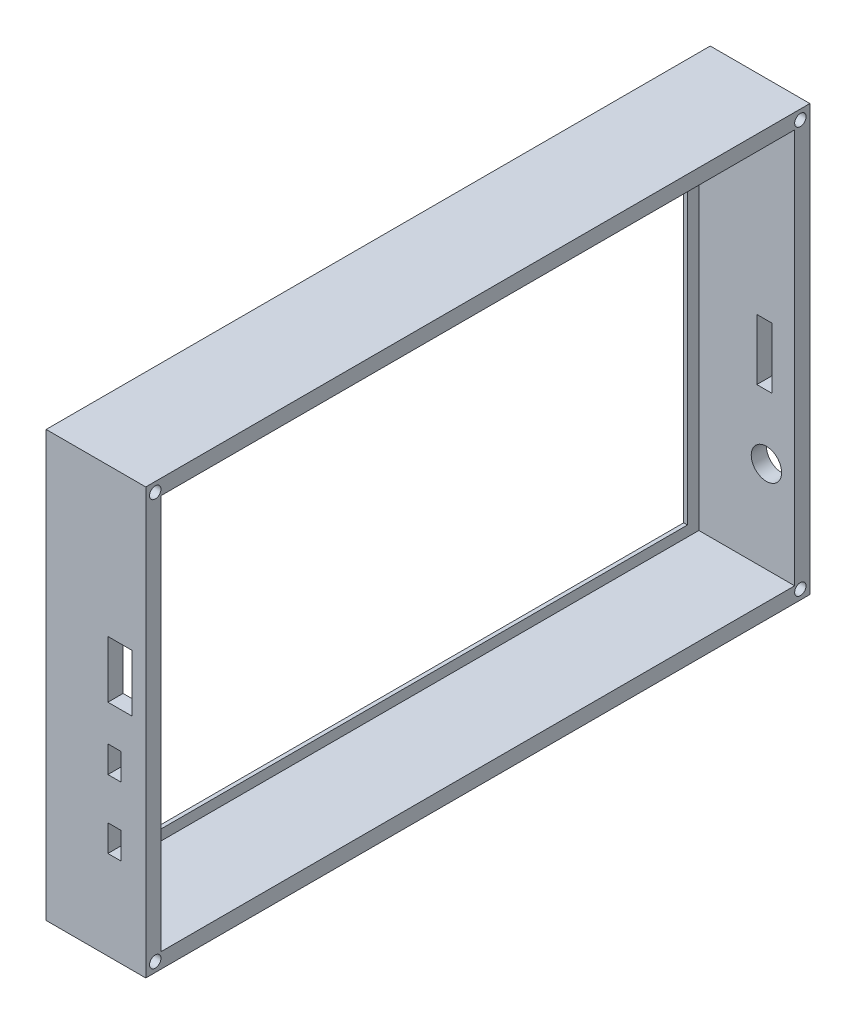
ISO-10303-21;
HEADER;
FILE_DESCRIPTION(('STEP AP214'),'2;1');
FILE_NAME('part.step','',(''),(''),'','','');
FILE_SCHEMA(('AUTOMOTIVE_DESIGN { 1 0 10303 214 1 1 1 1 }'));
ENDSEC;
DATA;
#1=APPLICATION_CONTEXT('core data for automotive mechanical design processes');
#2=APPLICATION_PROTOCOL_DEFINITION('international standard','automotive_design',2000,#1);
#3=PRODUCT_CONTEXT('',#1,'mechanical');
#4=PRODUCT('Part','Part','',(#3));
#5=PRODUCT_RELATED_PRODUCT_CATEGORY('part','',(#4));
#6=PRODUCT_DEFINITION_FORMATION('','',#4);
#7=PRODUCT_DEFINITION_CONTEXT('part definition',#1,'design');
#8=PRODUCT_DEFINITION('design','',#6,#7);
#9=PRODUCT_DEFINITION_SHAPE('','',#8);
#10=(LENGTH_UNIT() NAMED_UNIT(*) SI_UNIT(.MILLI.,.METRE.));
#11=(NAMED_UNIT(*) PLANE_ANGLE_UNIT() SI_UNIT($,.RADIAN.));
#12=(NAMED_UNIT(*) SI_UNIT($,.STERADIAN.) SOLID_ANGLE_UNIT());
#13=UNCERTAINTY_MEASURE_WITH_UNIT(LENGTH_MEASURE(1.E-05),#10,'distance_accuracy_value','');
#14=(GEOMETRIC_REPRESENTATION_CONTEXT(3) GLOBAL_UNCERTAINTY_ASSIGNED_CONTEXT((#13)) GLOBAL_UNIT_ASSIGNED_CONTEXT((#10,
#11,#12)) REPRESENTATION_CONTEXT('',''));
#15=CARTESIAN_POINT('',(0.,0.,0.));
#16=DIRECTION('',(0.,0.,1.));
#17=DIRECTION('',(1.,0.,0.));
#18=AXIS2_PLACEMENT_3D('',#15,#16,#17);
#19=CARTESIAN_POINT('',(14.27,56.,-87.45));
#20=DIRECTION('',(0.,0.,1.));
#21=DIRECTION('',(0.,-1.,0.));
#22=AXIS2_PLACEMENT_3D('',#19,#20,#21);
#23=PLANE('',#22);
#24=CARTESIAN_POINT('',(17.7917133498615,-27.9016659787927,-87.45));
#25=DIRECTION('',(0.,0.,-1.));
#26=DIRECTION('',(0.,1.,0.));
#27=AXIS2_PLACEMENT_3D('',#24,#25,#26);
#28=CIRCLE('',#27,4.);
#29=CARTESIAN_POINT('',(17.7917133498615,-23.9016659787927,-87.45));
#30=VERTEX_POINT('',#29);
#31=EDGE_CURVE('E292',#30,#30,#28,.T.);
#32=ORIENTED_EDGE('',*,*,#31,.F.);
#33=EDGE_LOOP('',(#32));
#34=FACE_BOUND('',#33,.T.);
#35=DIRECTION('',(-1.,0.,0.));
#36=VECTOR('',#35,1.);
#37=CARTESIAN_POINT('',(19.2699999999931,-11.0826754547106,-87.45));
#38=LINE('',#37,#36);
#39=CARTESIAN_POINT('',(19.2699999999931,-11.0826754547105,-87.45));
#40=VERTEX_POINT('',#39);
#41=CARTESIAN_POINT('',(15.2699999999931,-11.0826754547106,-87.45));
#42=VERTEX_POINT('',#41);
#43=EDGE_CURVE('E490',#40,#42,#38,.T.);
#44=ORIENTED_EDGE('',*,*,#43,.F.);
#45=DIRECTION('',(0.,-1.,0.));
#46=VECTOR('',#45,1.);
#47=CARTESIAN_POINT('',(19.2699999999931,4.91732454528945,-87.45));
#48=LINE('',#47,#46);
#49=CARTESIAN_POINT('',(19.2699999999931,4.91732454528945,-87.45));
#50=VERTEX_POINT('',#49);
#51=EDGE_CURVE('E328',#50,#40,#48,.T.);
#52=ORIENTED_EDGE('',*,*,#51,.F.);
#53=DIRECTION('',(1.,0.,0.));
#54=VECTOR('',#53,1.);
#55=CARTESIAN_POINT('',(19.2699999999931,4.91732454528945,-87.45));
#56=LINE('',#55,#54);
#57=CARTESIAN_POINT('',(15.2699999999931,4.91732454528945,-87.45));
#58=VERTEX_POINT('',#57);
#59=EDGE_CURVE('E330',#58,#50,#56,.T.);
#60=ORIENTED_EDGE('',*,*,#59,.F.);
#61=DIRECTION('',(0.,1.,0.));
#62=VECTOR('',#61,1.);
#63=CARTESIAN_POINT('',(15.2699999999931,4.91732454528945,-87.45));
#64=LINE('',#63,#62);
#65=EDGE_CURVE('E312',#42,#58,#64,.T.);
#66=ORIENTED_EDGE('',*,*,#65,.F.);
#67=EDGE_LOOP('',(#44,#52,#60,#66));
#68=FACE_BOUND('',#67,.T.);
#69=DIRECTION('',(0.,1.,0.));
#70=VECTOR('',#69,1.);
#71=CARTESIAN_POINT('',(25.2358949620603,56.,-87.45));
#72=LINE('',#71,#70);
#73=CARTESIAN_POINT('',(25.2358949620603,-56.,-87.45));
#74=VERTEX_POINT('',#73);
#75=CARTESIAN_POINT('',(25.2358949620603,56.,-87.45));
#76=VERTEX_POINT('',#75);
#77=EDGE_CURVE('E235',#74,#76,#72,.T.);
#78=ORIENTED_EDGE('',*,*,#77,.F.);
#79=DIRECTION('',(-1.,0.,0.));
#80=VECTOR('',#79,1.);
#81=CARTESIAN_POINT('',(14.27,-56.,-87.45));
#82=LINE('',#81,#80);
#83=CARTESIAN_POINT('',(-1.,-56.,-87.45));
#84=VERTEX_POINT('',#83);
#85=EDGE_CURVE('E241',#74,#84,#82,.T.);
#86=ORIENTED_EDGE('',*,*,#85,.T.);
#87=DIRECTION('',(0.,-1.,0.));
#88=VECTOR('',#87,1.);
#89=CARTESIAN_POINT('',(-1.,56.,-87.45));
#90=LINE('',#89,#88);
#91=CARTESIAN_POINT('',(-1.,56.,-87.45));
#92=VERTEX_POINT('',#91);
#93=EDGE_CURVE('E430',#92,#84,#90,.T.);
#94=ORIENTED_EDGE('',*,*,#93,.F.);
#95=DIRECTION('',(-1.,0.,0.));
#96=VECTOR('',#95,1.);
#97=CARTESIAN_POINT('',(14.27,56.,-87.45));
#98=LINE('',#97,#96);
#99=EDGE_CURVE('E243',#76,#92,#98,.T.);
#100=ORIENTED_EDGE('',*,*,#99,.F.);
#101=EDGE_LOOP('',(#78,#86,#94,#100));
#102=FACE_BOUND('',#101,.T.);
#103=ADVANCED_FACE('F50',(#34,#68,#102),#23,.F.);
#104=CARTESIAN_POINT('',(14.27,-56.,-87.45));
#105=DIRECTION('',(0.,1.,0.));
#106=DIRECTION('',(0.,0.,1.));
#107=AXIS2_PLACEMENT_3D('',#104,#105,#106);
#108=PLANE('',#107);
#109=DIRECTION('',(0.,0.,-1.));
#110=VECTOR('',#109,1.);
#111=CARTESIAN_POINT('',(25.2358949620603,-56.,91.95));
#112=LINE('',#111,#110);
#113=CARTESIAN_POINT('',(25.2358949620603,-56.,87.45));
#114=VERTEX_POINT('',#113);
#115=EDGE_CURVE('E230',#114,#74,#112,.T.);
#116=ORIENTED_EDGE('',*,*,#115,.F.);
#117=DIRECTION('',(-1.,0.,0.));
#118=VECTOR('',#117,1.);
#119=CARTESIAN_POINT('',(14.27,-56.,87.45));
#120=LINE('',#119,#118);
#121=CARTESIAN_POINT('',(-1.,-56.,87.45));
#122=VERTEX_POINT('',#121);
#123=EDGE_CURVE('E248',#114,#122,#120,.T.);
#124=ORIENTED_EDGE('',*,*,#123,.T.);
#125=DIRECTION('',(0.,0.,1.));
#126=VECTOR('',#125,1.);
#127=CARTESIAN_POINT('',(-1.,-56.,-87.45));
#128=LINE('',#127,#126);
#129=EDGE_CURVE('E250',#84,#122,#128,.T.);
#130=ORIENTED_EDGE('',*,*,#129,.F.);
#131=ORIENTED_EDGE('',*,*,#85,.F.);
#132=EDGE_LOOP('',(#116,#124,#130,#131));
#133=FACE_BOUND('',#132,.T.);
#134=ADVANCED_FACE('F244',(#133),#108,.F.);
#135=CARTESIAN_POINT('',(14.27,56.,-87.45));
#136=DIRECTION('',(0.,-1.,0.));
#137=DIRECTION('',(0.,0.,-1.));
#138=AXIS2_PLACEMENT_3D('',#135,#136,#137);
#139=PLANE('',#138);
#140=DIRECTION('',(-1.,0.,0.));
#141=VECTOR('',#140,1.);
#142=CARTESIAN_POINT('',(14.27,56.,87.45));
#143=LINE('',#142,#141);
#144=CARTESIAN_POINT('',(25.2358949620603,56.,87.45));
#145=VERTEX_POINT('',#144);
#146=CARTESIAN_POINT('',(-1.,56.,87.45));
#147=VERTEX_POINT('',#146);
#148=EDGE_CURVE('E255',#145,#147,#143,.T.);
#149=ORIENTED_EDGE('',*,*,#148,.F.);
#150=DIRECTION('',(0.,0.,-1.));
#151=VECTOR('',#150,1.);
#152=CARTESIAN_POINT('',(25.2358949620603,56.,91.95));
#153=LINE('',#152,#151);
#154=EDGE_CURVE('E61',#145,#76,#153,.T.);
#155=ORIENTED_EDGE('',*,*,#154,.T.);
#156=ORIENTED_EDGE('',*,*,#99,.T.);
#157=DIRECTION('',(0.,0.,-1.));
#158=VECTOR('',#157,1.);
#159=CARTESIAN_POINT('',(-1.,56.,-87.45));
#160=LINE('',#159,#158);
#161=EDGE_CURVE('E433',#147,#92,#160,.T.);
#162=ORIENTED_EDGE('',*,*,#161,.F.);
#163=EDGE_LOOP('',(#149,#155,#156,#162));
#164=FACE_BOUND('',#163,.T.);
#165=ADVANCED_FACE('F497',(#164),#139,.F.);
#166=CARTESIAN_POINT('',(14.27,56.,87.45));
#167=DIRECTION('',(0.,0.,-1.));
#168=DIRECTION('',(0.,1.,0.));
#169=AXIS2_PLACEMENT_3D('',#166,#167,#168);
#170=PLANE('',#169);
#171=DIRECTION('',(-1.,0.,0.));
#172=VECTOR('',#171,1.);
#173=CARTESIAN_POINT('',(21.5699999999924,16.9173245452894,87.45));
#174=LINE('',#173,#172);
#175=CARTESIAN_POINT('',(21.5699999999924,16.9173245452894,87.45));
#176=VERTEX_POINT('',#175);
#177=CARTESIAN_POINT('',(15.2699999999924,16.9173245452894,87.45));
#178=VERTEX_POINT('',#177);
#179=EDGE_CURVE('E339',#176,#178,#174,.T.);
#180=ORIENTED_EDGE('',*,*,#179,.F.);
#181=DIRECTION('',(0.,1.,0.));
#182=VECTOR('',#181,1.);
#183=CARTESIAN_POINT('',(21.5699999999924,1.91732454528944,87.45));
#184=LINE('',#183,#182);
#185=CARTESIAN_POINT('',(21.5699999999924,1.91732454528944,87.45));
#186=VERTEX_POINT('',#185);
#187=EDGE_CURVE('E340',#186,#176,#184,.T.);
#188=ORIENTED_EDGE('',*,*,#187,.F.);
#189=DIRECTION('',(1.,0.,0.));
#190=VECTOR('',#189,1.);
#191=CARTESIAN_POINT('',(15.2699999999924,1.91732454528944,87.45));
#192=LINE('',#191,#190);
#193=CARTESIAN_POINT('',(15.2699999999924,1.91732454528944,87.45));
#194=VERTEX_POINT('',#193);
#195=EDGE_CURVE('E346',#194,#186,#192,.T.);
#196=ORIENTED_EDGE('',*,*,#195,.F.);
#197=DIRECTION('',(0.,-1.,0.));
#198=VECTOR('',#197,1.);
#199=CARTESIAN_POINT('',(15.2699999999924,16.9173245452894,87.45));
#200=LINE('',#199,#198);
#201=EDGE_CURVE('E345',#178,#194,#200,.T.);
#202=ORIENTED_EDGE('',*,*,#201,.F.);
#203=EDGE_LOOP('',(#180,#188,#196,#202));
#204=FACE_BOUND('',#203,.T.);
#205=DIRECTION('',(1.,0.,0.));
#206=VECTOR('',#205,1.);
#207=CARTESIAN_POINT('',(18.7699999999924,-14.5826754547106,87.45));
#208=LINE('',#207,#206);
#209=CARTESIAN_POINT('',(15.2699999999924,-14.5826754547106,87.45));
#210=VERTEX_POINT('',#209);
#211=CARTESIAN_POINT('',(18.7699999999924,-14.5826754547106,87.45));
#212=VERTEX_POINT('',#211);
#213=EDGE_CURVE('E374',#210,#212,#208,.T.);
#214=ORIENTED_EDGE('',*,*,#213,.F.);
#215=DIRECTION('',(0.,-1.,0.));
#216=VECTOR('',#215,1.);
#217=CARTESIAN_POINT('',(15.2699999999924,-14.5826754547106,87.45));
#218=LINE('',#217,#216);
#219=CARTESIAN_POINT('',(15.2699999999924,-7.58267545471055,87.45));
#220=VERTEX_POINT('',#219);
#221=EDGE_CURVE('E338',#220,#210,#218,.T.);
#222=ORIENTED_EDGE('',*,*,#221,.F.);
#223=DIRECTION('',(-1.,0.,0.));
#224=VECTOR('',#223,1.);
#225=CARTESIAN_POINT('',(15.2699999999924,-7.58267545471055,87.45));
#226=LINE('',#225,#224);
#227=CARTESIAN_POINT('',(18.7699999999924,-7.58267545471055,87.45));
#228=VERTEX_POINT('',#227);
#229=EDGE_CURVE('E365',#228,#220,#226,.T.);
#230=ORIENTED_EDGE('',*,*,#229,.F.);
#231=DIRECTION('',(0.,1.,0.));
#232=VECTOR('',#231,1.);
#233=CARTESIAN_POINT('',(18.7699999999924,-7.58267545471055,87.45));
#234=LINE('',#233,#232);
#235=EDGE_CURVE('E375',#212,#228,#234,.T.);
#236=ORIENTED_EDGE('',*,*,#235,.F.);
#237=EDGE_LOOP('',(#214,#222,#230,#236));
#238=FACE_BOUND('',#237,.T.);
#239=DIRECTION('',(0.,-1.,0.));
#240=VECTOR('',#239,1.);
#241=CARTESIAN_POINT('',(15.2699999999924,-32.5826754547106,87.45));
#242=LINE('',#241,#240);
#243=CARTESIAN_POINT('',(15.2699999999924,-25.5826754547106,87.45));
#244=VERTEX_POINT('',#243);
#245=CARTESIAN_POINT('',(15.2699999999924,-32.5826754547106,87.45));
#246=VERTEX_POINT('',#245);
#247=EDGE_CURVE('E394',#244,#246,#242,.T.);
#248=ORIENTED_EDGE('',*,*,#247,.F.);
#249=DIRECTION('',(-1.,0.,0.));
#250=VECTOR('',#249,1.);
#251=CARTESIAN_POINT('',(15.2699999999924,-25.5826754547106,87.45));
#252=LINE('',#251,#250);
#253=CARTESIAN_POINT('',(18.7699999999924,-25.5826754547106,87.45));
#254=VERTEX_POINT('',#253);
#255=EDGE_CURVE('E367',#254,#244,#252,.T.);
#256=ORIENTED_EDGE('',*,*,#255,.F.);
#257=DIRECTION('',(0.,1.,0.));
#258=VECTOR('',#257,1.);
#259=CARTESIAN_POINT('',(18.7699999999924,-25.5826754547106,87.45));
#260=LINE('',#259,#258);
#261=CARTESIAN_POINT('',(18.7699999999924,-32.5826754547106,87.45));
#262=VERTEX_POINT('',#261);
#263=EDGE_CURVE('E385',#262,#254,#260,.T.);
#264=ORIENTED_EDGE('',*,*,#263,.F.);
#265=DIRECTION('',(1.,0.,0.));
#266=VECTOR('',#265,1.);
#267=CARTESIAN_POINT('',(18.7699999999924,-32.5826754547106,87.45));
#268=LINE('',#267,#266);
#269=EDGE_CURVE('E387',#246,#262,#268,.T.);
#270=ORIENTED_EDGE('',*,*,#269,.F.);
#271=EDGE_LOOP('',(#248,#256,#264,#270));
#272=FACE_BOUND('',#271,.T.);
#273=ORIENTED_EDGE('',*,*,#123,.F.);
#274=DIRECTION('',(0.,1.,0.));
#275=VECTOR('',#274,1.);
#276=CARTESIAN_POINT('',(25.2358949620603,56.,87.45));
#277=LINE('',#276,#275);
#278=EDGE_CURVE('E231',#114,#145,#277,.T.);
#279=ORIENTED_EDGE('',*,*,#278,.T.);
#280=ORIENTED_EDGE('',*,*,#148,.T.);
#281=DIRECTION('',(0.,1.,0.));
#282=VECTOR('',#281,1.);
#283=CARTESIAN_POINT('',(-1.,56.,87.45));
#284=LINE('',#283,#282);
#285=EDGE_CURVE('E427',#122,#147,#284,.T.);
#286=ORIENTED_EDGE('',*,*,#285,.F.);
#287=EDGE_LOOP('',(#273,#279,#280,#286));
#288=FACE_BOUND('',#287,.T.);
#289=ADVANCED_FACE('F591',(#204,#238,#272,#288),#170,.F.);
#290=CARTESIAN_POINT('',(14.27,52.,-83.45));
#291=DIRECTION('',(0.,0.,1.));
#292=DIRECTION('',(0.,-1.,0.));
#293=AXIS2_PLACEMENT_3D('',#290,#291,#292);
#294=PLANE('',#293);
#295=DIRECTION('',(0.,-1.,0.));
#296=VECTOR('',#295,1.);
#297=CARTESIAN_POINT('',(25.2358949620603,52.,-83.45));
#298=LINE('',#297,#296);
#299=CARTESIAN_POINT('',(25.2358949620603,52.,-83.45));
#300=VERTEX_POINT('',#299);
#301=CARTESIAN_POINT('',(25.2358949620603,-52.,-83.45));
#302=VERTEX_POINT('',#301);
#303=EDGE_CURVE('E70',#300,#302,#298,.T.);
#304=ORIENTED_EDGE('',*,*,#303,.F.);
#305=DIRECTION('',(-1.,0.,0.));
#306=VECTOR('',#305,1.);
#307=CARTESIAN_POINT('',(14.27,52.,-83.45));
#308=LINE('',#307,#306);
#309=CARTESIAN_POINT('',(0.,52.,-83.45));
#310=VERTEX_POINT('',#309);
#311=EDGE_CURVE('E249',#300,#310,#308,.T.);
#312=ORIENTED_EDGE('',*,*,#311,.T.);
#313=DIRECTION('',(0.,1.,0.));
#314=VECTOR('',#313,1.);
#315=CARTESIAN_POINT('',(0.,52.,-83.45));
#316=LINE('',#315,#314);
#317=CARTESIAN_POINT('',(0.,-52.,-83.45));
#318=VERTEX_POINT('',#317);
#319=EDGE_CURVE('E436',#318,#310,#316,.T.);
#320=ORIENTED_EDGE('',*,*,#319,.F.);
#321=DIRECTION('',(-1.,0.,0.));
#322=VECTOR('',#321,1.);
#323=CARTESIAN_POINT('',(14.27,-52.,-83.45));
#324=LINE('',#323,#322);
#325=EDGE_CURVE('E449',#302,#318,#324,.T.);
#326=ORIENTED_EDGE('',*,*,#325,.F.);
#327=EDGE_LOOP('',(#304,#312,#320,#326));
#328=FACE_BOUND('',#327,.T.);
#329=DIRECTION('',(0.,1.,0.));
#330=VECTOR('',#329,1.);
#331=CARTESIAN_POINT('',(19.2699999999931,52.,-83.45));
#332=LINE('',#331,#330);
#333=CARTESIAN_POINT('',(19.2699999999931,-11.0826754547106,-83.45));
#334=VERTEX_POINT('',#333);
#335=CARTESIAN_POINT('',(19.2699999999931,4.91732454528945,-83.45));
#336=VERTEX_POINT('',#335);
#337=EDGE_CURVE('E11',#334,#336,#332,.T.);
#338=ORIENTED_EDGE('',*,*,#337,.F.);
#339=DIRECTION('',(1.,0.,0.));
#340=VECTOR('',#339,1.);
#341=CARTESIAN_POINT('',(14.27,-11.0826754547105,-83.45));
#342=LINE('',#341,#340);
#343=CARTESIAN_POINT('',(15.2699999999931,-11.0826754547105,-83.45));
#344=VERTEX_POINT('',#343);
#345=EDGE_CURVE('E290',#344,#334,#342,.T.);
#346=ORIENTED_EDGE('',*,*,#345,.F.);
#347=DIRECTION('',(0.,-1.,0.));
#348=VECTOR('',#347,1.);
#349=CARTESIAN_POINT('',(15.2699999999931,52.,-83.45));
#350=LINE('',#349,#348);
#351=CARTESIAN_POINT('',(15.2699999999931,4.91732454528945,-83.45));
#352=VERTEX_POINT('',#351);
#353=EDGE_CURVE('E295',#352,#344,#350,.T.);
#354=ORIENTED_EDGE('',*,*,#353,.F.);
#355=DIRECTION('',(-1.,0.,0.));
#356=VECTOR('',#355,1.);
#357=CARTESIAN_POINT('',(14.27,4.91732454528945,-83.45));
#358=LINE('',#357,#356);
#359=EDGE_CURVE('E54',#336,#352,#358,.T.);
#360=ORIENTED_EDGE('',*,*,#359,.F.);
#361=EDGE_LOOP('',(#338,#346,#354,#360));
#362=FACE_BOUND('',#361,.T.);
#363=CARTESIAN_POINT('',(17.7917133498615,-27.9016659787927,-83.45));
#364=DIRECTION('',(0.,0.,1.));
#365=DIRECTION('',(0.,-1.,0.));
#366=AXIS2_PLACEMENT_3D('',#363,#364,#365);
#367=CIRCLE('',#366,4.);
#368=CARTESIAN_POINT('',(17.7917133498615,-31.9016659787927,-83.45));
#369=VERTEX_POINT('',#368);
#370=EDGE_CURVE('E286',#369,#369,#367,.T.);
#371=ORIENTED_EDGE('',*,*,#370,.F.);
#372=EDGE_LOOP('',(#371));
#373=FACE_BOUND('',#372,.T.);
#374=ADVANCED_FACE('F320',(#328,#362,#373),#294,.T.);
#375=CARTESIAN_POINT('',(14.27,52.,-83.45));
#376=DIRECTION('',(0.,-1.,0.));
#377=DIRECTION('',(0.,0.,-1.));
#378=AXIS2_PLACEMENT_3D('',#375,#376,#377);
#379=PLANE('',#378);
#380=DIRECTION('',(0.,0.,-1.));
#381=VECTOR('',#380,1.);
#382=CARTESIAN_POINT('',(25.2358949620603,52.,-83.45));
#383=LINE('',#382,#381);
#384=CARTESIAN_POINT('',(25.2358949620603,52.,83.45));
#385=VERTEX_POINT('',#384);
#386=EDGE_CURVE('E459',#385,#300,#383,.T.);
#387=ORIENTED_EDGE('',*,*,#386,.F.);
#388=DIRECTION('',(-1.,0.,0.));
#389=VECTOR('',#388,1.);
#390=CARTESIAN_POINT('',(14.27,52.,83.45));
#391=LINE('',#390,#389);
#392=CARTESIAN_POINT('',(0.,52.,83.45));
#393=VERTEX_POINT('',#392);
#394=EDGE_CURVE('E251',#385,#393,#391,.T.);
#395=ORIENTED_EDGE('',*,*,#394,.T.);
#396=DIRECTION('',(0.,0.,1.));
#397=VECTOR('',#396,1.);
#398=CARTESIAN_POINT('',(0.,52.,-83.45));
#399=LINE('',#398,#397);
#400=EDGE_CURVE('E437',#310,#393,#399,.T.);
#401=ORIENTED_EDGE('',*,*,#400,.F.);
#402=ORIENTED_EDGE('',*,*,#311,.F.);
#403=EDGE_LOOP('',(#387,#395,#401,#402));
#404=FACE_BOUND('',#403,.T.);
#405=ADVANCED_FACE('F456',(#404),#379,.T.);
#406=CARTESIAN_POINT('',(14.27,52.,83.45));
#407=DIRECTION('',(0.,0.,-1.));
#408=DIRECTION('',(0.,1.,0.));
#409=AXIS2_PLACEMENT_3D('',#406,#407,#408);
#410=PLANE('',#409);
#411=DIRECTION('',(0.,1.,0.));
#412=VECTOR('',#411,1.);
#413=CARTESIAN_POINT('',(25.2358949620603,52.,83.45));
#414=LINE('',#413,#412);
#415=CARTESIAN_POINT('',(25.2358949620603,-52.,83.45));
#416=VERTEX_POINT('',#415);
#417=EDGE_CURVE('E475',#416,#385,#414,.T.);
#418=ORIENTED_EDGE('',*,*,#417,.F.);
#419=DIRECTION('',(-1.,0.,0.));
#420=VECTOR('',#419,1.);
#421=CARTESIAN_POINT('',(14.27,-52.,83.45));
#422=LINE('',#421,#420);
#423=CARTESIAN_POINT('',(0.,-52.,83.45));
#424=VERTEX_POINT('',#423);
#425=EDGE_CURVE('E448',#416,#424,#422,.T.);
#426=ORIENTED_EDGE('',*,*,#425,.T.);
#427=DIRECTION('',(0.,-1.,0.));
#428=VECTOR('',#427,1.);
#429=CARTESIAN_POINT('',(0.,52.,83.45));
#430=LINE('',#429,#428);
#431=EDGE_CURVE('E445',#393,#424,#430,.T.);
#432=ORIENTED_EDGE('',*,*,#431,.F.);
#433=ORIENTED_EDGE('',*,*,#394,.F.);
#434=EDGE_LOOP('',(#418,#426,#432,#433));
#435=FACE_BOUND('',#434,.T.);
#436=DIRECTION('',(0.,-1.,0.));
#437=VECTOR('',#436,1.);
#438=CARTESIAN_POINT('',(21.5699999999924,52.,83.45));
#439=LINE('',#438,#437);
#440=CARTESIAN_POINT('',(21.5699999999924,16.9173245452894,83.45));
#441=VERTEX_POINT('',#440);
#442=CARTESIAN_POINT('',(21.5699999999924,1.91732454528944,83.45));
#443=VERTEX_POINT('',#442);
#444=EDGE_CURVE('E285',#441,#443,#439,.T.);
#445=ORIENTED_EDGE('',*,*,#444,.F.);
#446=DIRECTION('',(1.,0.,0.));
#447=VECTOR('',#446,1.);
#448=CARTESIAN_POINT('',(14.27,16.9173245452894,83.45));
#449=LINE('',#448,#447);
#450=CARTESIAN_POINT('',(15.2699999999924,16.9173245452894,83.45));
#451=VERTEX_POINT('',#450);
#452=EDGE_CURVE('E280',#451,#441,#449,.T.);
#453=ORIENTED_EDGE('',*,*,#452,.F.);
#454=DIRECTION('',(0.,1.,0.));
#455=VECTOR('',#454,1.);
#456=CARTESIAN_POINT('',(15.2699999999924,52.,83.45));
#457=LINE('',#456,#455);
#458=CARTESIAN_POINT('',(15.2699999999924,1.91732454528944,83.45));
#459=VERTEX_POINT('',#458);
#460=EDGE_CURVE('E277',#459,#451,#457,.T.);
#461=ORIENTED_EDGE('',*,*,#460,.F.);
#462=DIRECTION('',(-1.,0.,0.));
#463=VECTOR('',#462,1.);
#464=CARTESIAN_POINT('',(14.27,1.91732454528944,83.45));
#465=LINE('',#464,#463);
#466=EDGE_CURVE('E284',#443,#459,#465,.T.);
#467=ORIENTED_EDGE('',*,*,#466,.F.);
#468=EDGE_LOOP('',(#445,#453,#461,#467));
#469=FACE_BOUND('',#468,.T.);
#470=DIRECTION('',(0.,1.,0.));
#471=VECTOR('',#470,1.);
#472=CARTESIAN_POINT('',(15.2699999999924,52.,83.45));
#473=LINE('',#472,#471);
#474=CARTESIAN_POINT('',(15.2699999999924,-14.5826754547106,83.45));
#475=VERTEX_POINT('',#474);
#476=CARTESIAN_POINT('',(15.2699999999924,-7.58267545471055,83.45));
#477=VERTEX_POINT('',#476);
#478=EDGE_CURVE('E279',#475,#477,#473,.T.);
#479=ORIENTED_EDGE('',*,*,#478,.F.);
#480=DIRECTION('',(-1.,0.,0.));
#481=VECTOR('',#480,1.);
#482=CARTESIAN_POINT('',(14.27,-14.5826754547106,83.45));
#483=LINE('',#482,#481);
#484=CARTESIAN_POINT('',(18.7699999999924,-14.5826754547106,83.45));
#485=VERTEX_POINT('',#484);
#486=EDGE_CURVE('E269',#485,#475,#483,.T.);
#487=ORIENTED_EDGE('',*,*,#486,.F.);
#488=DIRECTION('',(0.,-1.,0.));
#489=VECTOR('',#488,1.);
#490=CARTESIAN_POINT('',(18.7699999999924,52.,83.45));
#491=LINE('',#490,#489);
#492=CARTESIAN_POINT('',(18.7699999999924,-7.58267545471055,83.45));
#493=VERTEX_POINT('',#492);
#494=EDGE_CURVE('E272',#493,#485,#491,.T.);
#495=ORIENTED_EDGE('',*,*,#494,.F.);
#496=DIRECTION('',(1.,0.,0.));
#497=VECTOR('',#496,1.);
#498=CARTESIAN_POINT('',(14.27,-7.58267545471055,83.45));
#499=LINE('',#498,#497);
#500=EDGE_CURVE('E274',#477,#493,#499,.T.);
#501=ORIENTED_EDGE('',*,*,#500,.F.);
#502=EDGE_LOOP('',(#479,#487,#495,#501));
#503=FACE_BOUND('',#502,.T.);
#504=DIRECTION('',(1.,0.,0.));
#505=VECTOR('',#504,1.);
#506=CARTESIAN_POINT('',(14.27,-25.5826754547106,83.45));
#507=LINE('',#506,#505);
#508=CARTESIAN_POINT('',(15.2699999999924,-25.5826754547106,83.45));
#509=VERTEX_POINT('',#508);
#510=CARTESIAN_POINT('',(18.7699999999924,-25.5826754547106,83.45));
#511=VERTEX_POINT('',#510);
#512=EDGE_CURVE('E270',#509,#511,#507,.T.);
#513=ORIENTED_EDGE('',*,*,#512,.F.);
#514=DIRECTION('',(0.,1.,0.));
#515=VECTOR('',#514,1.);
#516=CARTESIAN_POINT('',(15.2699999999924,52.,83.45));
#517=LINE('',#516,#515);
#518=CARTESIAN_POINT('',(15.2699999999924,-32.5826754547106,83.45));
#519=VERTEX_POINT('',#518);
#520=EDGE_CURVE('E257',#519,#509,#517,.T.);
#521=ORIENTED_EDGE('',*,*,#520,.F.);
#522=DIRECTION('',(-1.,0.,0.));
#523=VECTOR('',#522,1.);
#524=CARTESIAN_POINT('',(14.2699999999998,-32.5826754547106,83.45));
#525=LINE('',#524,#523);
#526=CARTESIAN_POINT('',(18.7699999999924,-32.5826754547106,83.45));
#527=VERTEX_POINT('',#526);
#528=EDGE_CURVE('E262',#527,#519,#525,.T.);
#529=ORIENTED_EDGE('',*,*,#528,.F.);
#530=DIRECTION('',(0.,-1.,0.));
#531=VECTOR('',#530,1.);
#532=CARTESIAN_POINT('',(18.7699999999924,52.,83.45));
#533=LINE('',#532,#531);
#534=EDGE_CURVE('E265',#511,#527,#533,.T.);
#535=ORIENTED_EDGE('',*,*,#534,.F.);
#536=EDGE_LOOP('',(#513,#521,#529,#535));
#537=FACE_BOUND('',#536,.T.);
#538=ADVANCED_FACE('F463',(#435,#469,#503,#537),#410,.T.);
#539=CARTESIAN_POINT('',(14.27,-52.,-83.45));
#540=DIRECTION('',(0.,1.,0.));
#541=DIRECTION('',(0.,0.,1.));
#542=AXIS2_PLACEMENT_3D('',#539,#540,#541);
#543=PLANE('',#542);
#544=DIRECTION('',(0.,0.,1.));
#545=VECTOR('',#544,1.);
#546=CARTESIAN_POINT('',(25.2358949620603,-52.,-83.45));
#547=LINE('',#546,#545);
#548=EDGE_CURVE('E630',#302,#416,#547,.T.);
#549=ORIENTED_EDGE('',*,*,#548,.F.);
#550=ORIENTED_EDGE('',*,*,#325,.T.);
#551=DIRECTION('',(0.,0.,-1.));
#552=VECTOR('',#551,1.);
#553=CARTESIAN_POINT('',(0.,-52.,-83.45));
#554=LINE('',#553,#552);
#555=EDGE_CURVE('E444',#424,#318,#554,.T.);
#556=ORIENTED_EDGE('',*,*,#555,.F.);
#557=ORIENTED_EDGE('',*,*,#425,.F.);
#558=EDGE_LOOP('',(#549,#550,#556,#557));
#559=FACE_BOUND('',#558,.T.);
#560=ADVANCED_FACE('F585',(#559),#543,.T.);
#561=CARTESIAN_POINT('',(0.,0.,0.));
#562=DIRECTION('',(-1.,0.,0.));
#563=DIRECTION('',(0.,0.,1.));
#564=AXIS2_PLACEMENT_3D('',#561,#562,#563);
#565=PLANE('',#564);
#566=DIRECTION('',(0.,-1.,0.));
#567=VECTOR('',#566,1.);
#568=CARTESIAN_POINT('',(0.,49.125,-80.45));
#569=LINE('',#568,#567);
#570=CARTESIAN_POINT('',(0.,49.125,-80.45));
#571=VERTEX_POINT('',#570);
#572=CARTESIAN_POINT('',(0.,-49.249406291834,-80.45));
#573=VERTEX_POINT('',#572);
#574=EDGE_CURVE('E355',#571,#573,#569,.T.);
#575=ORIENTED_EDGE('',*,*,#574,.T.);
#576=DIRECTION('',(0.,0.,1.));
#577=VECTOR('',#576,1.);
#578=CARTESIAN_POINT('',(0.,-49.249406291834,-80.45));
#579=LINE('',#578,#577);
#580=CARTESIAN_POINT('',(0.,-49.249406291834,80.45));
#581=VERTEX_POINT('',#580);
#582=EDGE_CURVE('E407',#573,#581,#579,.T.);
#583=ORIENTED_EDGE('',*,*,#582,.T.);
#584=DIRECTION('',(0.,1.,0.));
#585=VECTOR('',#584,1.);
#586=CARTESIAN_POINT('',(0.,49.125,80.45));
#587=LINE('',#586,#585);
#588=CARTESIAN_POINT('',(0.,49.125,80.45));
#589=VERTEX_POINT('',#588);
#590=EDGE_CURVE('E414',#581,#589,#587,.T.);
#591=ORIENTED_EDGE('',*,*,#590,.T.);
#592=DIRECTION('',(0.,0.,-1.));
#593=VECTOR('',#592,1.);
#594=CARTESIAN_POINT('',(0.,49.125,-80.45));
#595=LINE('',#594,#593);
#596=EDGE_CURVE('E397',#589,#571,#595,.T.);
#597=ORIENTED_EDGE('',*,*,#596,.T.);
#598=EDGE_LOOP('',(#575,#583,#591,#597));
#599=FACE_BOUND('',#598,.T.);
#600=ORIENTED_EDGE('',*,*,#431,.T.);
#601=ORIENTED_EDGE('',*,*,#555,.T.);
#602=ORIENTED_EDGE('',*,*,#319,.T.);
#603=ORIENTED_EDGE('',*,*,#400,.T.);
#604=EDGE_LOOP('',(#600,#601,#602,#603));
#605=FACE_BOUND('',#604,.T.);
#606=ADVANCED_FACE('F467',(#599,#605),#565,.F.);
#607=CARTESIAN_POINT('',(-1.,0.,0.));
#608=DIRECTION('',(-1.,0.,0.));
#609=DIRECTION('',(0.,0.,1.));
#610=AXIS2_PLACEMENT_3D('',#607,#608,#609);
#611=PLANE('',#610);
#612=ORIENTED_EDGE('',*,*,#93,.T.);
#613=ORIENTED_EDGE('',*,*,#129,.T.);
#614=ORIENTED_EDGE('',*,*,#285,.T.);
#615=ORIENTED_EDGE('',*,*,#161,.T.);
#616=EDGE_LOOP('',(#612,#613,#614,#615));
#617=FACE_BOUND('',#616,.T.);
#618=DIRECTION('',(0.,0.,1.));
#619=VECTOR('',#618,1.);
#620=CARTESIAN_POINT('',(-1.,-49.249406291834,-80.45));
#621=LINE('',#620,#619);
#622=CARTESIAN_POINT('',(-1.,-49.249406291834,-80.45));
#623=VERTEX_POINT('',#622);
#624=CARTESIAN_POINT('',(-1.,-49.249406291834,80.45));
#625=VERTEX_POINT('',#624);
#626=EDGE_CURVE('E399',#623,#625,#621,.T.);
#627=ORIENTED_EDGE('',*,*,#626,.F.);
#628=DIRECTION('',(0.,-1.,0.));
#629=VECTOR('',#628,1.);
#630=CARTESIAN_POINT('',(-1.,49.125,-80.45));
#631=LINE('',#630,#629);
#632=CARTESIAN_POINT('',(-1.,49.125,-80.45));
#633=VERTEX_POINT('',#632);
#634=EDGE_CURVE('E400',#633,#623,#631,.T.);
#635=ORIENTED_EDGE('',*,*,#634,.F.);
#636=DIRECTION('',(0.,0.,-1.));
#637=VECTOR('',#636,1.);
#638=CARTESIAN_POINT('',(-1.,49.125,-80.45));
#639=LINE('',#638,#637);
#640=CARTESIAN_POINT('',(-1.,49.125,80.45));
#641=VERTEX_POINT('',#640);
#642=EDGE_CURVE('E403',#641,#633,#639,.T.);
#643=ORIENTED_EDGE('',*,*,#642,.F.);
#644=DIRECTION('',(0.,1.,0.));
#645=VECTOR('',#644,1.);
#646=CARTESIAN_POINT('',(-1.,49.125,80.45));
#647=LINE('',#646,#645);
#648=EDGE_CURVE('E405',#625,#641,#647,.T.);
#649=ORIENTED_EDGE('',*,*,#648,.F.);
#650=EDGE_LOOP('',(#627,#635,#643,#649));
#651=FACE_BOUND('',#650,.T.);
#652=ADVANCED_FACE('F577',(#617,#651),#611,.T.);
#653=CARTESIAN_POINT('',(-1.,49.125,-80.45));
#654=DIRECTION('',(0.,0.,1.));
#655=DIRECTION('',(0.,-1.,0.));
#656=AXIS2_PLACEMENT_3D('',#653,#654,#655);
#657=PLANE('',#656);
#658=ORIENTED_EDGE('',*,*,#574,.F.);
#659=DIRECTION('',(1.,0.,0.));
#660=VECTOR('',#659,1.);
#661=CARTESIAN_POINT('',(-1.,49.125,-80.45));
#662=LINE('',#661,#660);
#663=EDGE_CURVE('E406',#633,#571,#662,.T.);
#664=ORIENTED_EDGE('',*,*,#663,.F.);
#665=ORIENTED_EDGE('',*,*,#634,.T.);
#666=DIRECTION('',(1.,0.,0.));
#667=VECTOR('',#666,1.);
#668=CARTESIAN_POINT('',(-1.,-49.249406291834,-80.45));
#669=LINE('',#668,#667);
#670=EDGE_CURVE('E425',#623,#573,#669,.T.);
#671=ORIENTED_EDGE('',*,*,#670,.T.);
#672=EDGE_LOOP('',(#658,#664,#665,#671));
#673=FACE_BOUND('',#672,.T.);
#674=ADVANCED_FACE('F575',(#673),#657,.T.);
#675=CARTESIAN_POINT('',(-1.,-49.249406291834,-80.45));
#676=DIRECTION('',(0.,1.,0.));
#677=DIRECTION('',(0.,0.,1.));
#678=AXIS2_PLACEMENT_3D('',#675,#676,#677);
#679=PLANE('',#678);
#680=ORIENTED_EDGE('',*,*,#582,.F.);
#681=ORIENTED_EDGE('',*,*,#670,.F.);
#682=ORIENTED_EDGE('',*,*,#626,.T.);
#683=DIRECTION('',(1.,0.,0.));
#684=VECTOR('',#683,1.);
#685=CARTESIAN_POINT('',(-1.,-49.249406291834,80.45));
#686=LINE('',#685,#684);
#687=EDGE_CURVE('E422',#625,#581,#686,.T.);
#688=ORIENTED_EDGE('',*,*,#687,.T.);
#689=EDGE_LOOP('',(#680,#681,#682,#688));
#690=FACE_BOUND('',#689,.T.);
#691=ADVANCED_FACE('F568',(#690),#679,.T.);
#692=CARTESIAN_POINT('',(-1.,49.125,80.45));
#693=DIRECTION('',(0.,0.,-1.));
#694=DIRECTION('',(0.,1.,0.));
#695=AXIS2_PLACEMENT_3D('',#692,#693,#694);
#696=PLANE('',#695);
#697=ORIENTED_EDGE('',*,*,#590,.F.);
#698=ORIENTED_EDGE('',*,*,#687,.F.);
#699=ORIENTED_EDGE('',*,*,#648,.T.);
#700=DIRECTION('',(1.,0.,0.));
#701=VECTOR('',#700,1.);
#702=CARTESIAN_POINT('',(-1.,49.125,80.45));
#703=LINE('',#702,#701);
#704=EDGE_CURVE('E417',#641,#589,#703,.T.);
#705=ORIENTED_EDGE('',*,*,#704,.T.);
#706=EDGE_LOOP('',(#697,#698,#699,#705));
#707=FACE_BOUND('',#706,.T.);
#708=ADVANCED_FACE('F562',(#707),#696,.T.);
#709=CARTESIAN_POINT('',(-1.,49.125,-80.45));
#710=DIRECTION('',(0.,-1.,0.));
#711=DIRECTION('',(0.,0.,-1.));
#712=AXIS2_PLACEMENT_3D('',#709,#710,#711);
#713=PLANE('',#712);
#714=ORIENTED_EDGE('',*,*,#596,.F.);
#715=ORIENTED_EDGE('',*,*,#704,.F.);
#716=ORIENTED_EDGE('',*,*,#642,.T.);
#717=ORIENTED_EDGE('',*,*,#663,.T.);
#718=EDGE_LOOP('',(#714,#715,#716,#717));
#719=FACE_BOUND('',#718,.T.);
#720=ADVANCED_FACE('F547',(#719),#713,.T.);
#721=CARTESIAN_POINT('',(15.2699999999924,-25.5826754547106,80.45));
#722=DIRECTION('',(0.,1.,0.));
#723=DIRECTION('',(0.,0.,1.));
#724=AXIS2_PLACEMENT_3D('',#721,#722,#723);
#725=PLANE('',#724);
#726=ORIENTED_EDGE('',*,*,#512,.T.);
#727=DIRECTION('',(0.,0.,1.));
#728=VECTOR('',#727,1.);
#729=CARTESIAN_POINT('',(18.7699999999924,-25.5826754547106,80.45));
#730=LINE('',#729,#728);
#731=EDGE_CURVE('E293',#511,#254,#730,.T.);
#732=ORIENTED_EDGE('',*,*,#731,.T.);
#733=ORIENTED_EDGE('',*,*,#255,.T.);
#734=DIRECTION('',(0.,0.,1.));
#735=VECTOR('',#734,1.);
#736=CARTESIAN_POINT('',(15.2699999999924,-25.5826754547106,80.45));
#737=LINE('',#736,#735);
#738=EDGE_CURVE('E378',#509,#244,#737,.T.);
#739=ORIENTED_EDGE('',*,*,#738,.F.);
#740=EDGE_LOOP('',(#726,#732,#733,#739));
#741=FACE_BOUND('',#740,.T.);
#742=ADVANCED_FACE('F548',(#741),#725,.F.);
#743=CARTESIAN_POINT('',(18.7699999999924,-25.5826754547106,80.45));
#744=DIRECTION('',(1.,0.,0.));
#745=DIRECTION('',(0.,0.,-1.));
#746=AXIS2_PLACEMENT_3D('',#743,#744,#745);
#747=PLANE('',#746);
#748=ORIENTED_EDGE('',*,*,#534,.T.);
#749=DIRECTION('',(0.,0.,1.));
#750=VECTOR('',#749,1.);
#751=CARTESIAN_POINT('',(18.7699999999924,-32.5826754547106,80.45));
#752=LINE('',#751,#750);
#753=EDGE_CURVE('E383',#527,#262,#752,.T.);
#754=ORIENTED_EDGE('',*,*,#753,.T.);
#755=ORIENTED_EDGE('',*,*,#263,.T.);
#756=ORIENTED_EDGE('',*,*,#731,.F.);
#757=EDGE_LOOP('',(#748,#754,#755,#756));
#758=FACE_BOUND('',#757,.T.);
#759=ADVANCED_FACE('F549',(#758),#747,.F.);
#760=CARTESIAN_POINT('',(18.7699999999924,-32.5826754547106,80.45));
#761=DIRECTION('',(0.,-1.,0.));
#762=DIRECTION('',(1.,0.,0.));
#763=AXIS2_PLACEMENT_3D('',#760,#761,#762);
#764=PLANE('',#763);
#765=ORIENTED_EDGE('',*,*,#528,.T.);
#766=DIRECTION('',(0.,0.,1.));
#767=VECTOR('',#766,1.);
#768=CARTESIAN_POINT('',(15.2699999999924,-32.5826754547106,80.45));
#769=LINE('',#768,#767);
#770=EDGE_CURVE('E384',#519,#246,#769,.T.);
#771=ORIENTED_EDGE('',*,*,#770,.T.);
#772=ORIENTED_EDGE('',*,*,#269,.T.);
#773=ORIENTED_EDGE('',*,*,#753,.F.);
#774=EDGE_LOOP('',(#765,#771,#772,#773));
#775=FACE_BOUND('',#774,.T.);
#776=ADVANCED_FACE('F555',(#775),#764,.F.);
#777=CARTESIAN_POINT('',(15.2699999999924,-32.5826754547106,80.45));
#778=DIRECTION('',(-1.,0.,0.));
#779=DIRECTION('',(0.,0.,1.));
#780=AXIS2_PLACEMENT_3D('',#777,#778,#779);
#781=PLANE('',#780);
#782=ORIENTED_EDGE('',*,*,#520,.T.);
#783=ORIENTED_EDGE('',*,*,#738,.T.);
#784=ORIENTED_EDGE('',*,*,#247,.T.);
#785=ORIENTED_EDGE('',*,*,#770,.F.);
#786=EDGE_LOOP('',(#782,#783,#784,#785));
#787=FACE_BOUND('',#786,.T.);
#788=ADVANCED_FACE('F534',(#787),#781,.F.);
#789=CARTESIAN_POINT('',(15.2699999999924,-14.5826754547106,80.45));
#790=DIRECTION('',(-1.,0.,0.));
#791=DIRECTION('',(0.,0.,1.));
#792=AXIS2_PLACEMENT_3D('',#789,#790,#791);
#793=PLANE('',#792);
#794=ORIENTED_EDGE('',*,*,#478,.T.);
#795=DIRECTION('',(0.,0.,1.));
#796=VECTOR('',#795,1.);
#797=CARTESIAN_POINT('',(15.2699999999924,-7.58267545471055,80.45));
#798=LINE('',#797,#796);
#799=EDGE_CURVE('E370',#477,#220,#798,.T.);
#800=ORIENTED_EDGE('',*,*,#799,.T.);
#801=ORIENTED_EDGE('',*,*,#221,.T.);
#802=DIRECTION('',(0.,0.,1.));
#803=VECTOR('',#802,1.);
#804=CARTESIAN_POINT('',(15.2699999999924,-14.5826754547106,80.45));
#805=LINE('',#804,#803);
#806=EDGE_CURVE('E360',#475,#210,#805,.T.);
#807=ORIENTED_EDGE('',*,*,#806,.F.);
#808=EDGE_LOOP('',(#794,#800,#801,#807));
#809=FACE_BOUND('',#808,.T.);
#810=ADVANCED_FACE('F527',(#809),#793,.F.);
#811=CARTESIAN_POINT('',(15.2699999999924,-7.58267545471055,80.45));
#812=DIRECTION('',(0.,1.,0.));
#813=DIRECTION('',(0.,0.,1.));
#814=AXIS2_PLACEMENT_3D('',#811,#812,#813);
#815=PLANE('',#814);
#816=ORIENTED_EDGE('',*,*,#500,.T.);
#817=DIRECTION('',(0.,0.,1.));
#818=VECTOR('',#817,1.);
#819=CARTESIAN_POINT('',(18.7699999999924,-7.58267545471055,80.45));
#820=LINE('',#819,#818);
#821=EDGE_CURVE('E362',#493,#228,#820,.T.);
#822=ORIENTED_EDGE('',*,*,#821,.T.);
#823=ORIENTED_EDGE('',*,*,#229,.T.);
#824=ORIENTED_EDGE('',*,*,#799,.F.);
#825=EDGE_LOOP('',(#816,#822,#823,#824));
#826=FACE_BOUND('',#825,.T.);
#827=ADVANCED_FACE('F531',(#826),#815,.F.);
#828=CARTESIAN_POINT('',(18.7699999999924,-7.58267545471055,80.45));
#829=DIRECTION('',(1.,0.,0.));
#830=DIRECTION('',(0.,0.,-1.));
#831=AXIS2_PLACEMENT_3D('',#828,#829,#830);
#832=PLANE('',#831);
#833=ORIENTED_EDGE('',*,*,#494,.T.);
#834=DIRECTION('',(0.,0.,1.));
#835=VECTOR('',#834,1.);
#836=CARTESIAN_POINT('',(18.7699999999924,-14.5826754547106,80.45));
#837=LINE('',#836,#835);
#838=EDGE_CURVE('E361',#485,#212,#837,.T.);
#839=ORIENTED_EDGE('',*,*,#838,.T.);
#840=ORIENTED_EDGE('',*,*,#235,.T.);
#841=ORIENTED_EDGE('',*,*,#821,.F.);
#842=EDGE_LOOP('',(#833,#839,#840,#841));
#843=FACE_BOUND('',#842,.T.);
#844=ADVANCED_FACE('F540',(#843),#832,.F.);
#845=CARTESIAN_POINT('',(18.7699999999924,-14.5826754547106,80.45));
#846=DIRECTION('',(0.,-1.,0.));
#847=DIRECTION('',(0.,0.,-1.));
#848=AXIS2_PLACEMENT_3D('',#845,#846,#847);
#849=PLANE('',#848);
#850=ORIENTED_EDGE('',*,*,#486,.T.);
#851=ORIENTED_EDGE('',*,*,#806,.T.);
#852=ORIENTED_EDGE('',*,*,#213,.T.);
#853=ORIENTED_EDGE('',*,*,#838,.F.);
#854=EDGE_LOOP('',(#850,#851,#852,#853));
#855=FACE_BOUND('',#854,.T.);
#856=ADVANCED_FACE('F526',(#855),#849,.F.);
#857=CARTESIAN_POINT('',(21.5699999999924,1.91732454528944,80.45));
#858=DIRECTION('',(1.,0.,0.));
#859=DIRECTION('',(0.,0.,-1.));
#860=AXIS2_PLACEMENT_3D('',#857,#858,#859);
#861=PLANE('',#860);
#862=ORIENTED_EDGE('',*,*,#444,.T.);
#863=DIRECTION('',(0.,0.,1.));
#864=VECTOR('',#863,1.);
#865=CARTESIAN_POINT('',(21.5699999999924,1.91732454528944,80.45));
#866=LINE('',#865,#864);
#867=EDGE_CURVE('E350',#443,#186,#866,.T.);
#868=ORIENTED_EDGE('',*,*,#867,.T.);
#869=ORIENTED_EDGE('',*,*,#187,.T.);
#870=DIRECTION('',(0.,0.,1.));
#871=VECTOR('',#870,1.);
#872=CARTESIAN_POINT('',(21.5699999999924,16.9173245452894,80.45));
#873=LINE('',#872,#871);
#874=EDGE_CURVE('E348',#441,#176,#873,.T.);
#875=ORIENTED_EDGE('',*,*,#874,.F.);
#876=EDGE_LOOP('',(#862,#868,#869,#875));
#877=FACE_BOUND('',#876,.T.);
#878=ADVANCED_FACE('F521',(#877),#861,.F.);
#879=CARTESIAN_POINT('',(15.2699999999924,1.91732454528944,80.45));
#880=DIRECTION('',(0.,-1.,0.));
#881=DIRECTION('',(0.,0.,-1.));
#882=AXIS2_PLACEMENT_3D('',#879,#880,#881);
#883=PLANE('',#882);
#884=ORIENTED_EDGE('',*,*,#466,.T.);
#885=DIRECTION('',(0.,0.,1.));
#886=VECTOR('',#885,1.);
#887=CARTESIAN_POINT('',(15.2699999999924,1.91732454528944,80.45));
#888=LINE('',#887,#886);
#889=EDGE_CURVE('E351',#459,#194,#888,.T.);
#890=ORIENTED_EDGE('',*,*,#889,.T.);
#891=ORIENTED_EDGE('',*,*,#195,.T.);
#892=ORIENTED_EDGE('',*,*,#867,.F.);
#893=EDGE_LOOP('',(#884,#890,#891,#892));
#894=FACE_BOUND('',#893,.T.);
#895=ADVANCED_FACE('F520',(#894),#883,.F.);
#896=CARTESIAN_POINT('',(15.2699999999924,16.9173245452894,80.45));
#897=DIRECTION('',(-1.,0.,0.));
#898=DIRECTION('',(0.,0.,1.));
#899=AXIS2_PLACEMENT_3D('',#896,#897,#898);
#900=PLANE('',#899);
#901=ORIENTED_EDGE('',*,*,#460,.T.);
#902=DIRECTION('',(0.,0.,1.));
#903=VECTOR('',#902,1.);
#904=CARTESIAN_POINT('',(15.2699999999924,16.9173245452894,80.45));
#905=LINE('',#904,#903);
#906=EDGE_CURVE('E352',#451,#178,#905,.T.);
#907=ORIENTED_EDGE('',*,*,#906,.T.);
#908=ORIENTED_EDGE('',*,*,#201,.T.);
#909=ORIENTED_EDGE('',*,*,#889,.F.);
#910=EDGE_LOOP('',(#901,#907,#908,#909));
#911=FACE_BOUND('',#910,.T.);
#912=ADVANCED_FACE('F514',(#911),#900,.F.);
#913=CARTESIAN_POINT('',(21.5699999999924,16.9173245452894,80.45));
#914=DIRECTION('',(0.,1.,0.));
#915=DIRECTION('',(0.,0.,1.));
#916=AXIS2_PLACEMENT_3D('',#913,#914,#915);
#917=PLANE('',#916);
#918=ORIENTED_EDGE('',*,*,#452,.T.);
#919=ORIENTED_EDGE('',*,*,#874,.T.);
#920=ORIENTED_EDGE('',*,*,#179,.T.);
#921=ORIENTED_EDGE('',*,*,#906,.F.);
#922=EDGE_LOOP('',(#918,#919,#920,#921));
#923=FACE_BOUND('',#922,.T.);
#924=ADVANCED_FACE('F504',(#923),#917,.F.);
#925=CARTESIAN_POINT('',(17.7917133498615,-27.9016659787927,-80.45));
#926=DIRECTION('',(0.,0.,-1.));
#927=DIRECTION('',(0.,1.,0.));
#928=AXIS2_PLACEMENT_3D('',#925,#926,#927);
#929=CYLINDRICAL_SURFACE('',#928,4.);
#930=ORIENTED_EDGE('',*,*,#370,.T.);
#931=EDGE_LOOP('',(#930));
#932=FACE_BOUND('',#931,.T.);
#933=ORIENTED_EDGE('',*,*,#31,.T.);
#934=EDGE_LOOP('',(#933));
#935=FACE_BOUND('',#934,.T.);
#936=ADVANCED_FACE('F503',(#932,#935),#929,.F.);
#937=CARTESIAN_POINT('',(19.2699999999931,4.91732454528945,-80.45));
#938=DIRECTION('',(1.,0.,0.));
#939=DIRECTION('',(0.,0.,-1.));
#940=AXIS2_PLACEMENT_3D('',#937,#938,#939);
#941=PLANE('',#940);
#942=ORIENTED_EDGE('',*,*,#337,.T.);
#943=DIRECTION('',(0.,0.,-1.));
#944=VECTOR('',#943,1.);
#945=CARTESIAN_POINT('',(19.2699999999931,4.91732454528945,-80.45));
#946=LINE('',#945,#944);
#947=EDGE_CURVE('E304',#336,#50,#946,.T.);
#948=ORIENTED_EDGE('',*,*,#947,.T.);
#949=ORIENTED_EDGE('',*,*,#51,.T.);
#950=DIRECTION('',(0.,0.,-1.));
#951=VECTOR('',#950,1.);
#952=CARTESIAN_POINT('',(19.2699999999931,-11.0826754547106,-80.45));
#953=LINE('',#952,#951);
#954=EDGE_CURVE('E323',#334,#40,#953,.T.);
#955=ORIENTED_EDGE('',*,*,#954,.F.);
#956=EDGE_LOOP('',(#942,#948,#949,#955));
#957=FACE_BOUND('',#956,.T.);
#958=ADVANCED_FACE('F327',(#957),#941,.F.);
#959=CARTESIAN_POINT('',(19.2699999999931,4.91732454528945,-80.45));
#960=DIRECTION('',(0.,1.,0.));
#961=DIRECTION('',(0.,0.,1.));
#962=AXIS2_PLACEMENT_3D('',#959,#960,#961);
#963=PLANE('',#962);
#964=ORIENTED_EDGE('',*,*,#359,.T.);
#965=DIRECTION('',(0.,0.,-1.));
#966=VECTOR('',#965,1.);
#967=CARTESIAN_POINT('',(15.2699999999931,4.91732454528945,-80.45));
#968=LINE('',#967,#966);
#969=EDGE_CURVE('E303',#352,#58,#968,.T.);
#970=ORIENTED_EDGE('',*,*,#969,.T.);
#971=ORIENTED_EDGE('',*,*,#59,.T.);
#972=ORIENTED_EDGE('',*,*,#947,.F.);
#973=EDGE_LOOP('',(#964,#970,#971,#972));
#974=FACE_BOUND('',#973,.T.);
#975=ADVANCED_FACE('F301',(#974),#963,.F.);
#976=CARTESIAN_POINT('',(15.2699999999931,4.91732454528945,-80.45));
#977=DIRECTION('',(-1.,0.,0.));
#978=DIRECTION('',(0.,0.,1.));
#979=AXIS2_PLACEMENT_3D('',#976,#977,#978);
#980=PLANE('',#979);
#981=ORIENTED_EDGE('',*,*,#353,.T.);
#982=DIRECTION('',(0.,0.,-1.));
#983=VECTOR('',#982,1.);
#984=CARTESIAN_POINT('',(15.2699999999931,-11.0826754547106,-80.45));
#985=LINE('',#984,#983);
#986=EDGE_CURVE('E314',#344,#42,#985,.T.);
#987=ORIENTED_EDGE('',*,*,#986,.T.);
#988=ORIENTED_EDGE('',*,*,#65,.T.);
#989=ORIENTED_EDGE('',*,*,#969,.F.);
#990=EDGE_LOOP('',(#981,#987,#988,#989));
#991=FACE_BOUND('',#990,.T.);
#992=ADVANCED_FACE('F309',(#991),#980,.F.);
#993=CARTESIAN_POINT('',(19.2699999999931,-11.0826754547106,-80.45));
#994=DIRECTION('',(0.,-1.,0.));
#995=DIRECTION('',(0.,0.,-1.));
#996=AXIS2_PLACEMENT_3D('',#993,#994,#995);
#997=PLANE('',#996);
#998=ORIENTED_EDGE('',*,*,#345,.T.);
#999=ORIENTED_EDGE('',*,*,#954,.T.);
#1000=ORIENTED_EDGE('',*,*,#43,.T.);
#1001=ORIENTED_EDGE('',*,*,#986,.F.);
#1002=EDGE_LOOP('',(#998,#999,#1000,#1001));
#1003=FACE_BOUND('',#1002,.T.);
#1004=ADVANCED_FACE('F321',(#1003),#997,.F.);
#1005=CARTESIAN_POINT('',(25.2358949620603,56.,91.95));
#1006=DIRECTION('',(-1.,0.,0.));
#1007=DIRECTION('',(0.,0.,1.));
#1008=AXIS2_PLACEMENT_3D('',#1005,#1006,#1007);
#1009=PLANE('',#1008);
#1010=ORIENTED_EDGE('',*,*,#303,.T.);
#1011=ORIENTED_EDGE('',*,*,#548,.T.);
#1012=ORIENTED_EDGE('',*,*,#417,.T.);
#1013=ORIENTED_EDGE('',*,*,#386,.T.);
#1014=EDGE_LOOP('',(#1010,#1011,#1012,#1013));
#1015=FACE_BOUND('',#1014,.T.);
#1016=CARTESIAN_POINT('',(25.2358949620603,53.5,-84.95));
#1017=DIRECTION('',(-1.,0.,0.));
#1018=DIRECTION('',(0.,0.,1.));
#1019=AXIS2_PLACEMENT_3D('',#1016,#1017,#1018);
#1020=CIRCLE('',#1019,1.5);
#1021=CARTESIAN_POINT('',(25.2358949620603,53.5,-83.45));
#1022=VERTEX_POINT('',#1021);
#1023=EDGE_CURVE('E623',#1022,#1022,#1020,.F.);
#1024=ORIENTED_EDGE('',*,*,#1023,.F.);
#1025=EDGE_LOOP('',(#1024));
#1026=FACE_BOUND('',#1025,.T.);
#1027=CARTESIAN_POINT('',(25.2358949620603,-53.5,84.95));
#1028=DIRECTION('',(-1.,0.,0.));
#1029=DIRECTION('',(0.,0.,1.));
#1030=AXIS2_PLACEMENT_3D('',#1027,#1028,#1029);
#1031=CIRCLE('',#1030,1.5);
#1032=CARTESIAN_POINT('',(25.2358949620603,-53.5,86.45));
#1033=VERTEX_POINT('',#1032);
#1034=EDGE_CURVE('E49',#1033,#1033,#1031,.F.);
#1035=ORIENTED_EDGE('',*,*,#1034,.F.);
#1036=EDGE_LOOP('',(#1035));
#1037=FACE_BOUND('',#1036,.T.);
#1038=CARTESIAN_POINT('',(25.2358949620603,-53.5,-84.95));
#1039=DIRECTION('',(-1.,0.,0.));
#1040=DIRECTION('',(0.,0.,1.));
#1041=AXIS2_PLACEMENT_3D('',#1038,#1039,#1040);
#1042=CIRCLE('',#1041,1.5);
#1043=CARTESIAN_POINT('',(25.2358949620603,-53.5,-83.45));
#1044=VERTEX_POINT('',#1043);
#1045=EDGE_CURVE('E617',#1044,#1044,#1042,.F.);
#1046=ORIENTED_EDGE('',*,*,#1045,.F.);
#1047=EDGE_LOOP('',(#1046));
#1048=FACE_BOUND('',#1047,.T.);
#1049=CARTESIAN_POINT('',(25.2358949620603,53.5,84.95));
#1050=DIRECTION('',(-1.,0.,0.));
#1051=DIRECTION('',(0.,0.,1.));
#1052=AXIS2_PLACEMENT_3D('',#1049,#1050,#1051);
#1053=CIRCLE('',#1052,1.5);
#1054=CARTESIAN_POINT('',(25.2358949620603,53.5,86.45));
#1055=VERTEX_POINT('',#1054);
#1056=EDGE_CURVE('E624',#1055,#1055,#1053,.F.);
#1057=ORIENTED_EDGE('',*,*,#1056,.F.);
#1058=EDGE_LOOP('',(#1057));
#1059=FACE_BOUND('',#1058,.T.);
#1060=ORIENTED_EDGE('',*,*,#115,.T.);
#1061=ORIENTED_EDGE('',*,*,#77,.T.);
#1062=ORIENTED_EDGE('',*,*,#154,.F.);
#1063=ORIENTED_EDGE('',*,*,#278,.F.);
#1064=EDGE_LOOP('',(#1060,#1061,#1062,#1063));
#1065=FACE_BOUND('',#1064,.T.);
#1066=ADVANCED_FACE('F233',(#1015,#1026,#1037,#1048,#1059,#1065),#1009,.F.);
#1067=CARTESIAN_POINT('',(3.87,-53.5,-84.95));
#1068=DIRECTION('',(1.,0.,0.));
#1069=DIRECTION('',(0.,0.,-1.));
#1070=AXIS2_PLACEMENT_3D('',#1067,#1068,#1069);
#1071=PLANE('',#1070);
#1072=CARTESIAN_POINT('',(3.87,-53.5,-84.95));
#1073=DIRECTION('',(1.,0.,0.));
#1074=DIRECTION('',(0.,0.,-1.));
#1075=AXIS2_PLACEMENT_3D('',#1072,#1073,#1074);
#1076=CIRCLE('',#1075,1.5);
#1077=CARTESIAN_POINT('',(3.87,-53.5,-86.45));
#1078=VERTEX_POINT('',#1077);
#1079=EDGE_CURVE('E483',#1078,#1078,#1076,.T.);
#1080=ORIENTED_EDGE('',*,*,#1079,.T.);
#1081=EDGE_LOOP('',(#1080));
#1082=FACE_BOUND('',#1081,.T.);
#1083=ADVANCED_FACE('F629',(#1082),#1071,.T.);
#1084=CARTESIAN_POINT('',(3.87,-53.5,-84.95));
#1085=DIRECTION('',(1.,0.,0.));
#1086=DIRECTION('',(0.,0.,-1.));
#1087=AXIS2_PLACEMENT_3D('',#1084,#1085,#1086);
#1088=CYLINDRICAL_SURFACE('',#1087,1.5);
#1089=ORIENTED_EDGE('',*,*,#1045,.T.);
#1090=EDGE_LOOP('',(#1089));
#1091=FACE_BOUND('',#1090,.T.);
#1092=ORIENTED_EDGE('',*,*,#1079,.F.);
#1093=EDGE_LOOP('',(#1092));
#1094=FACE_BOUND('',#1093,.T.);
#1095=ADVANCED_FACE('F863',(#1091,#1094),#1088,.F.);
#1096=CARTESIAN_POINT('',(3.87,53.5,-84.95));
#1097=DIRECTION('',(1.,0.,0.));
#1098=DIRECTION('',(0.,0.,-1.));
#1099=AXIS2_PLACEMENT_3D('',#1096,#1097,#1098);
#1100=PLANE('',#1099);
#1101=CARTESIAN_POINT('',(3.87,53.5,-84.95));
#1102=DIRECTION('',(1.,0.,0.));
#1103=DIRECTION('',(0.,0.,-1.));
#1104=AXIS2_PLACEMENT_3D('',#1101,#1102,#1103);
#1105=CIRCLE('',#1104,1.5);
#1106=CARTESIAN_POINT('',(3.87,53.5,-86.45));
#1107=VERTEX_POINT('',#1106);
#1108=EDGE_CURVE('E477',#1107,#1107,#1105,.T.);
#1109=ORIENTED_EDGE('',*,*,#1108,.T.);
#1110=EDGE_LOOP('',(#1109));
#1111=FACE_BOUND('',#1110,.T.);
#1112=ADVANCED_FACE('F658',(#1111),#1100,.T.);
#1113=CARTESIAN_POINT('',(3.87,53.5,-84.95));
#1114=DIRECTION('',(1.,0.,0.));
#1115=DIRECTION('',(0.,0.,-1.));
#1116=AXIS2_PLACEMENT_3D('',#1113,#1114,#1115);
#1117=CYLINDRICAL_SURFACE('',#1116,1.5);
#1118=ORIENTED_EDGE('',*,*,#1023,.T.);
#1119=EDGE_LOOP('',(#1118));
#1120=FACE_BOUND('',#1119,.T.);
#1121=ORIENTED_EDGE('',*,*,#1108,.F.);
#1122=EDGE_LOOP('',(#1121));
#1123=FACE_BOUND('',#1122,.T.);
#1124=ADVANCED_FACE('F648',(#1120,#1123),#1117,.F.);
#1125=CARTESIAN_POINT('',(3.87,53.5,84.95));
#1126=DIRECTION('',(1.,0.,0.));
#1127=DIRECTION('',(0.,0.,-1.));
#1128=AXIS2_PLACEMENT_3D('',#1125,#1126,#1127);
#1129=PLANE('',#1128);
#1130=CARTESIAN_POINT('',(3.87,53.5,84.95));
#1131=DIRECTION('',(1.,0.,0.));
#1132=DIRECTION('',(0.,0.,-1.));
#1133=AXIS2_PLACEMENT_3D('',#1130,#1131,#1132);
#1134=CIRCLE('',#1133,1.5);
#1135=CARTESIAN_POINT('',(3.87,53.5,83.45));
#1136=VERTEX_POINT('',#1135);
#1137=EDGE_CURVE('E480',#1136,#1136,#1134,.T.);
#1138=ORIENTED_EDGE('',*,*,#1137,.T.);
#1139=EDGE_LOOP('',(#1138));
#1140=FACE_BOUND('',#1139,.T.);
#1141=ADVANCED_FACE('F641',(#1140),#1129,.T.);
#1142=CARTESIAN_POINT('',(3.87,53.5,84.95));
#1143=DIRECTION('',(1.,0.,0.));
#1144=DIRECTION('',(0.,0.,-1.));
#1145=AXIS2_PLACEMENT_3D('',#1142,#1143,#1144);
#1146=CYLINDRICAL_SURFACE('',#1145,1.5);
#1147=ORIENTED_EDGE('',*,*,#1056,.T.);
#1148=EDGE_LOOP('',(#1147));
#1149=FACE_BOUND('',#1148,.T.);
#1150=ORIENTED_EDGE('',*,*,#1137,.F.);
#1151=EDGE_LOOP('',(#1150));
#1152=FACE_BOUND('',#1151,.T.);
#1153=ADVANCED_FACE('F639',(#1149,#1152),#1146,.F.);
#1154=CARTESIAN_POINT('',(3.87,-53.5,84.95));
#1155=DIRECTION('',(1.,0.,0.));
#1156=DIRECTION('',(0.,0.,-1.));
#1157=AXIS2_PLACEMENT_3D('',#1154,#1155,#1156);
#1158=PLANE('',#1157);
#1159=CARTESIAN_POINT('',(3.87,-53.5,84.95));
#1160=DIRECTION('',(1.,0.,0.));
#1161=DIRECTION('',(0.,0.,-1.));
#1162=AXIS2_PLACEMENT_3D('',#1159,#1160,#1161);
#1163=CIRCLE('',#1162,1.5);
#1164=CARTESIAN_POINT('',(3.87,-53.5,83.45));
#1165=VERTEX_POINT('',#1164);
#1166=EDGE_CURVE('E474',#1165,#1165,#1163,.T.);
#1167=ORIENTED_EDGE('',*,*,#1166,.T.);
#1168=EDGE_LOOP('',(#1167));
#1169=FACE_BOUND('',#1168,.T.);
#1170=ADVANCED_FACE('F644',(#1169),#1158,.T.);
#1171=CARTESIAN_POINT('',(3.87,-53.5,84.95));
#1172=DIRECTION('',(1.,0.,0.));
#1173=DIRECTION('',(0.,0.,-1.));
#1174=AXIS2_PLACEMENT_3D('',#1171,#1172,#1173);
#1175=CYLINDRICAL_SURFACE('',#1174,1.5);
#1176=ORIENTED_EDGE('',*,*,#1034,.T.);
#1177=EDGE_LOOP('',(#1176));
#1178=FACE_BOUND('',#1177,.T.);
#1179=ORIENTED_EDGE('',*,*,#1166,.F.);
#1180=EDGE_LOOP('',(#1179));
#1181=FACE_BOUND('',#1180,.T.);
#1182=ADVANCED_FACE('F884',(#1178,#1181),#1175,.F.);
#1183=CLOSED_SHELL('',(#103,#134,#165,#289,#374,#405,#538,#560,#606,#652,#674,#691,#708,#720,
#742,#759,#776,#788,#810,#827,#844,#856,#878,#895,#912,#924,#936,#958,#975,#992,#1004,#1066,
#1083,#1095,#1112,#1124,#1141,#1153,#1170,#1182));
#1184=MANIFOLD_SOLID_BREP('B2',#1183);
#1185=ADVANCED_BREP_SHAPE_REPRESENTATION('',(#18,#1184),#14);
#1186=SHAPE_DEFINITION_REPRESENTATION(#9,#1185);
ENDSEC;
END-ISO-10303-21;
